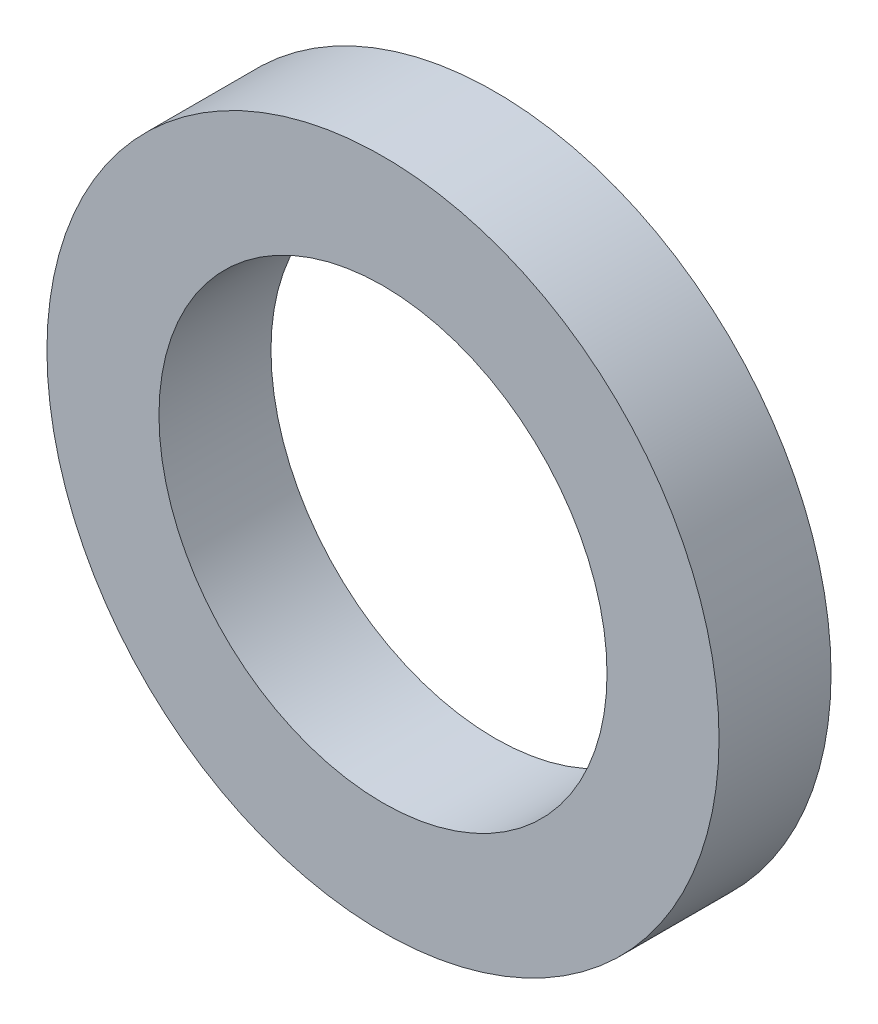
ISO-10303-21;
HEADER;
FILE_DESCRIPTION(('STEP AP214'),'2;1');
FILE_NAME('part.step','',(''),(''),'','','');
FILE_SCHEMA(('AUTOMOTIVE_DESIGN { 1 0 10303 214 1 1 1 1 }'));
ENDSEC;
DATA;
#1=APPLICATION_CONTEXT('core data for automotive mechanical design processes');
#2=APPLICATION_PROTOCOL_DEFINITION('international standard','automotive_design',2000,#1);
#3=PRODUCT_CONTEXT('',#1,'mechanical');
#4=PRODUCT('Part','Part','',(#3));
#5=PRODUCT_RELATED_PRODUCT_CATEGORY('part','',(#4));
#6=PRODUCT_DEFINITION_FORMATION('','',#4);
#7=PRODUCT_DEFINITION_CONTEXT('part definition',#1,'design');
#8=PRODUCT_DEFINITION('design','',#6,#7);
#9=PRODUCT_DEFINITION_SHAPE('','',#8);
#10=(LENGTH_UNIT() NAMED_UNIT(*) SI_UNIT(.MILLI.,.METRE.));
#11=(NAMED_UNIT(*) PLANE_ANGLE_UNIT() SI_UNIT($,.RADIAN.));
#12=(NAMED_UNIT(*) SI_UNIT($,.STERADIAN.) SOLID_ANGLE_UNIT());
#13=UNCERTAINTY_MEASURE_WITH_UNIT(LENGTH_MEASURE(1.E-05),#10,'distance_accuracy_value','');
#14=(GEOMETRIC_REPRESENTATION_CONTEXT(3) GLOBAL_UNCERTAINTY_ASSIGNED_CONTEXT((#13)) GLOBAL_UNIT_ASSIGNED_CONTEXT((#10,
#11,#12)) REPRESENTATION_CONTEXT('',''));
#15=CARTESIAN_POINT('',(0.,0.,0.));
#16=DIRECTION('',(0.,0.,1.));
#17=DIRECTION('',(1.,0.,0.));
#18=AXIS2_PLACEMENT_3D('',#15,#16,#17);
#19=CARTESIAN_POINT('',(0.,0.,5.));
#20=DIRECTION('',(0.,0.,1.));
#21=DIRECTION('',(1.,0.,0.));
#22=AXIS2_PLACEMENT_3D('',#19,#20,#21);
#23=PLANE('',#22);
#24=CARTESIAN_POINT('',(0.,0.,5.));
#25=DIRECTION('',(0.,0.,1.));
#26=DIRECTION('',(1.,0.,0.));
#27=AXIS2_PLACEMENT_3D('',#24,#25,#26);
#28=CIRCLE('',#27,15.);
#29=CARTESIAN_POINT('',(15.,0.,5.));
#30=VERTEX_POINT('',#29);
#31=EDGE_CURVE('E10',#30,#30,#28,.T.);
#32=ORIENTED_EDGE('',*,*,#31,.T.);
#33=EDGE_LOOP('',(#32));
#34=FACE_BOUND('',#33,.T.);
#35=CARTESIAN_POINT('',(0.,0.,5.));
#36=DIRECTION('',(0.,0.,1.));
#37=DIRECTION('',(1.,0.,0.));
#38=AXIS2_PLACEMENT_3D('',#35,#36,#37);
#39=CIRCLE('',#38,10.);
#40=CARTESIAN_POINT('',(10.,0.,5.));
#41=VERTEX_POINT('',#40);
#42=EDGE_CURVE('E42',#41,#41,#39,.T.);
#43=ORIENTED_EDGE('',*,*,#42,.F.);
#44=EDGE_LOOP('',(#43));
#45=FACE_BOUND('',#44,.T.);
#46=ADVANCED_FACE('F31',(#34,#45),#23,.T.);
#47=CARTESIAN_POINT('',(0.,0.,0.));
#48=DIRECTION('',(0.,0.,1.));
#49=DIRECTION('',(1.,0.,0.));
#50=AXIS2_PLACEMENT_3D('',#47,#48,#49);
#51=PLANE('',#50);
#52=CARTESIAN_POINT('',(0.,0.,0.));
#53=DIRECTION('',(0.,0.,1.));
#54=DIRECTION('',(1.,0.,0.));
#55=AXIS2_PLACEMENT_3D('',#52,#53,#54);
#56=CIRCLE('',#55,15.);
#57=CARTESIAN_POINT('',(15.,0.,0.));
#58=VERTEX_POINT('',#57);
#59=EDGE_CURVE('E35',#58,#58,#56,.T.);
#60=ORIENTED_EDGE('',*,*,#59,.F.);
#61=EDGE_LOOP('',(#60));
#62=FACE_BOUND('',#61,.T.);
#63=CARTESIAN_POINT('',(0.,0.,0.));
#64=DIRECTION('',(0.,0.,1.));
#65=DIRECTION('',(1.,0.,0.));
#66=AXIS2_PLACEMENT_3D('',#63,#64,#65);
#67=CIRCLE('',#66,10.);
#68=CARTESIAN_POINT('',(10.,0.,0.));
#69=VERTEX_POINT('',#68);
#70=EDGE_CURVE('E44',#69,#69,#67,.T.);
#71=ORIENTED_EDGE('',*,*,#70,.T.);
#72=EDGE_LOOP('',(#71));
#73=FACE_BOUND('',#72,.T.);
#74=ADVANCED_FACE('F54',(#62,#73),#51,.F.);
#75=CARTESIAN_POINT('',(0.,0.,5.));
#76=DIRECTION('',(0.,0.,-1.));
#77=DIRECTION('',(-1.,0.,0.));
#78=AXIS2_PLACEMENT_3D('',#75,#76,#77);
#79=CYLINDRICAL_SURFACE('',#78,15.);
#80=ORIENTED_EDGE('',*,*,#31,.F.);
#81=EDGE_LOOP('',(#80));
#82=FACE_BOUND('',#81,.T.);
#83=ORIENTED_EDGE('',*,*,#59,.T.);
#84=EDGE_LOOP('',(#83));
#85=FACE_BOUND('',#84,.T.);
#86=ADVANCED_FACE('F33',(#82,#85),#79,.T.);
#87=CARTESIAN_POINT('',(0.,0.,5.));
#88=DIRECTION('',(0.,0.,-1.));
#89=DIRECTION('',(-1.,0.,0.));
#90=AXIS2_PLACEMENT_3D('',#87,#88,#89);
#91=CYLINDRICAL_SURFACE('',#90,10.);
#92=ORIENTED_EDGE('',*,*,#42,.T.);
#93=EDGE_LOOP('',(#92));
#94=FACE_BOUND('',#93,.T.);
#95=ORIENTED_EDGE('',*,*,#70,.F.);
#96=EDGE_LOOP('',(#95));
#97=FACE_BOUND('',#96,.T.);
#98=ADVANCED_FACE('F50',(#94,#97),#91,.F.);
#99=CLOSED_SHELL('',(#46,#74,#86,#98));
#100=MANIFOLD_SOLID_BREP('B2',#99);
#101=ADVANCED_BREP_SHAPE_REPRESENTATION('',(#18,#100),#14);
#102=SHAPE_DEFINITION_REPRESENTATION(#9,#101);
ENDSEC;
END-ISO-10303-21;
